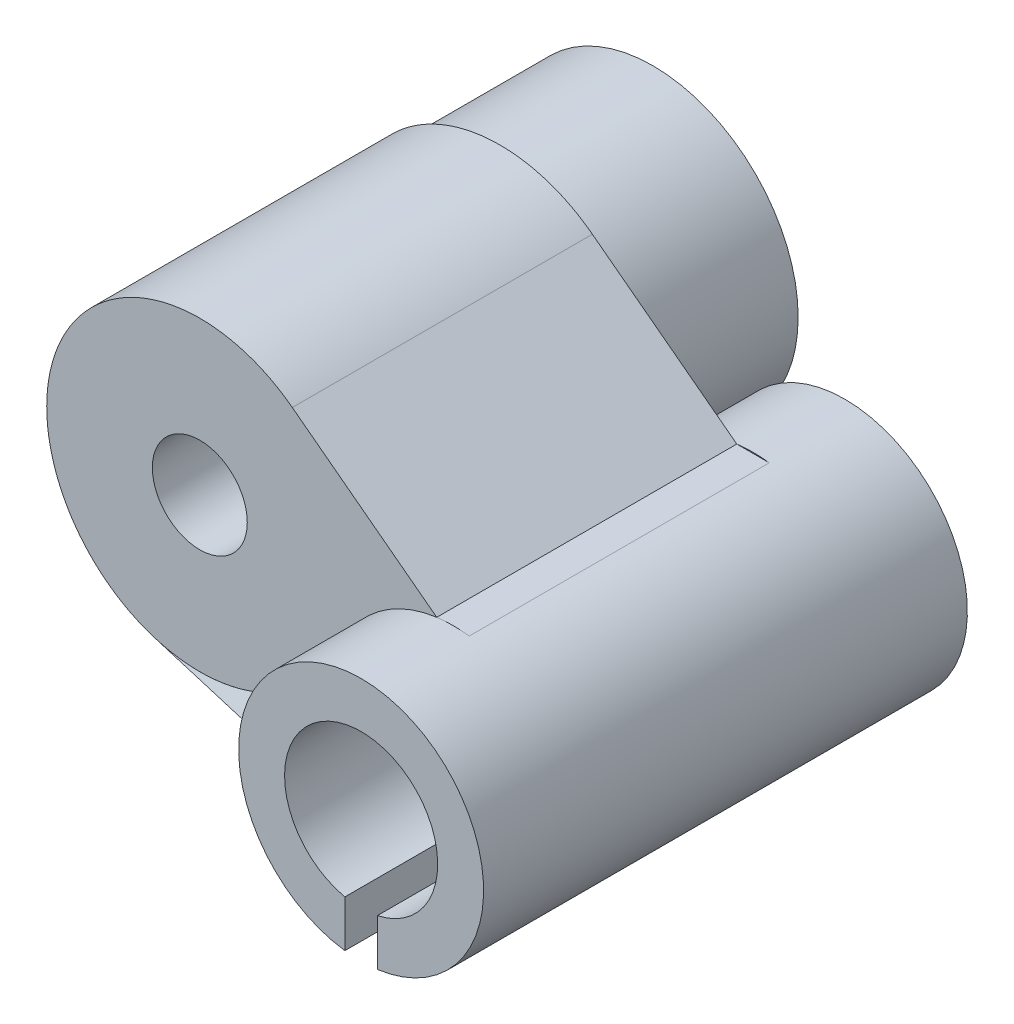
ISO-10303-21;
HEADER;
FILE_DESCRIPTION(('STEP AP214'),'2;1');
FILE_NAME('part.step','',(''),(''),'','','');
FILE_SCHEMA(('AUTOMOTIVE_DESIGN { 1 0 10303 214 1 1 1 1 }'));
ENDSEC;
DATA;
#1=APPLICATION_CONTEXT('core data for automotive mechanical design processes');
#2=APPLICATION_PROTOCOL_DEFINITION('international standard','automotive_design',2000,#1);
#3=PRODUCT_CONTEXT('',#1,'mechanical');
#4=PRODUCT('Part','Part','',(#3));
#5=PRODUCT_RELATED_PRODUCT_CATEGORY('part','',(#4));
#6=PRODUCT_DEFINITION_FORMATION('','',#4);
#7=PRODUCT_DEFINITION_CONTEXT('part definition',#1,'design');
#8=PRODUCT_DEFINITION('design','',#6,#7);
#9=PRODUCT_DEFINITION_SHAPE('','',#8);
#10=(LENGTH_UNIT() NAMED_UNIT(*) SI_UNIT(.MILLI.,.METRE.));
#11=(NAMED_UNIT(*) PLANE_ANGLE_UNIT() SI_UNIT($,.RADIAN.));
#12=(NAMED_UNIT(*) SI_UNIT($,.STERADIAN.) SOLID_ANGLE_UNIT());
#13=UNCERTAINTY_MEASURE_WITH_UNIT(LENGTH_MEASURE(1.E-05),#10,'distance_accuracy_value','');
#14=(GEOMETRIC_REPRESENTATION_CONTEXT(3) GLOBAL_UNCERTAINTY_ASSIGNED_CONTEXT((#13)) GLOBAL_UNIT_ASSIGNED_CONTEXT((#10,
#11,#12)) REPRESENTATION_CONTEXT('',''));
#15=CARTESIAN_POINT('',(0.,0.,0.));
#16=DIRECTION('',(0.,0.,1.));
#17=DIRECTION('',(1.,0.,0.));
#18=AXIS2_PLACEMENT_3D('',#15,#16,#17);
#19=CARTESIAN_POINT('',(0.,0.,0.));
#20=DIRECTION('',(0.,0.,1.));
#21=DIRECTION('',(1.,0.,0.));
#22=AXIS2_PLACEMENT_3D('',#19,#20,#21);
#23=PLANE('',#22);
#24=DIRECTION('',(0.796911314060259,-0.604096314773357,0.));
#25=VECTOR('',#24,1.);
#26=CARTESIAN_POINT('',(3.02048157386672,3.98455657030121,0.));
#27=LINE('',#26,#25);
#28=CARTESIAN_POINT('',(3.02048157386678,3.9845565703013,0.));
#29=VERTEX_POINT('',#28);
#30=CARTESIAN_POINT('',(7.73730203035666,0.408984477221739,0.));
#31=VERTEX_POINT('',#30);
#32=EDGE_CURVE('E50',#29,#31,#27,.T.);
#33=ORIENTED_EDGE('',*,*,#32,.T.);
#34=CARTESIAN_POINT('',(8.26783953936249,-3.55567565343347,0.));
#35=DIRECTION('',(0.,0.,1.));
#36=DIRECTION('',(1.,0.,0.));
#37=AXIS2_PLACEMENT_3D('',#34,#35,#36);
#38=CIRCLE('',#37,3.99999999998983);
#39=CARTESIAN_POINT('',(7.10561285640501,-7.38310679420404,0.));
#40=VERTEX_POINT('',#39);
#41=EDGE_CURVE('E43',#31,#40,#38,.T.);
#42=ORIENTED_EDGE('',*,*,#41,.T.);
#43=DIRECTION('',(-0.956857785199537,0.290556670725414,0.));
#44=VECTOR('',#43,1.);
#45=CARTESIAN_POINT('',(-1.4527833536177,-4.78428892596683,0.));
#46=LINE('',#45,#44);
#47=CARTESIAN_POINT('',(-1.35380663932124,-4.81434390908987,0.));
#48=VERTEX_POINT('',#47);
#49=EDGE_CURVE('E113',#40,#48,#46,.T.);
#50=ORIENTED_EDGE('',*,*,#49,.T.);
#51=CARTESIAN_POINT('',(-0.00105129220528597,-8.54083825260754E-05,0.));
#52=DIRECTION('',(0.,0.,-1.));
#53=DIRECTION('',(-1.,0.,0.));
#54=AXIS2_PLACEMENT_3D('',#51,#52,#53);
#55=CIRCLE('',#54,5.00070314463714);
#56=CARTESIAN_POINT('',(3.62377714828595,-3.44503108542732,0.));
#57=VERTEX_POINT('',#56);
#58=EDGE_CURVE('E138',#57,#48,#55,.T.);
#59=ORIENTED_EDGE('',*,*,#58,.F.);
#60=CARTESIAN_POINT('',(0.,0.,0.));
#61=DIRECTION('',(0.,0.,1.));
#62=DIRECTION('',(1.,0.,0.));
#63=AXIS2_PLACEMENT_3D('',#60,#61,#62);
#64=CIRCLE('',#63,5.);
#65=EDGE_CURVE('E126',#29,#57,#64,.T.);
#66=ORIENTED_EDGE('',*,*,#65,.F.);
#67=EDGE_LOOP('',(#33,#42,#50,#59,#66));
#68=FACE_BOUND('',#67,.T.);
#69=CARTESIAN_POINT('',(0.,0.,0.));
#70=DIRECTION('',(0.,0.,1.));
#71=DIRECTION('',(1.,0.,0.));
#72=AXIS2_PLACEMENT_3D('',#69,#70,#71);
#73=CIRCLE('',#72,4.74135826941333);
#74=CARTESIAN_POINT('',(4.74135826941333,0.,0.));
#75=VERTEX_POINT('',#74);
#76=EDGE_CURVE('E11',#75,#75,#73,.F.);
#77=ORIENTED_EDGE('',*,*,#76,.F.);
#78=EDGE_LOOP('',(#77));
#79=FACE_BOUND('',#78,.T.);
#80=ADVANCED_FACE('F35',(#68,#79),#23,.F.);
#81=CARTESIAN_POINT('',(0.,0.,9.8));
#82=DIRECTION('',(0.,0.,-1.));
#83=DIRECTION('',(-1.,0.,0.));
#84=AXIS2_PLACEMENT_3D('',#81,#82,#83);
#85=CYLINDRICAL_SURFACE('',#84,5.);
#86=DIRECTION('',(0.,0.,-1.));
#87=VECTOR('',#86,1.);
#88=CARTESIAN_POINT('',(3.62377714828595,-3.44503108542732,27.6300811187603));
#89=LINE('',#88,#87);
#90=CARTESIAN_POINT('',(3.62377714828595,-3.44503108542732,9.8));
#91=VERTEX_POINT('',#90);
#92=EDGE_CURVE('E132',#91,#57,#89,.T.);
#93=ORIENTED_EDGE('',*,*,#92,.F.);
#94=CARTESIAN_POINT('',(0.,0.,9.8));
#95=DIRECTION('',(0.,0.,1.));
#96=DIRECTION('',(1.,0.,0.));
#97=AXIS2_PLACEMENT_3D('',#94,#95,#96);
#98=CIRCLE('',#97,5.);
#99=CARTESIAN_POINT('',(3.02048157386679,3.9845565703013,9.8));
#100=VERTEX_POINT('',#99);
#101=EDGE_CURVE('E101',#100,#91,#98,.T.);
#102=ORIENTED_EDGE('',*,*,#101,.F.);
#103=DIRECTION('',(0.,0.,-1.));
#104=VECTOR('',#103,1.);
#105=CARTESIAN_POINT('',(3.02048157386672,3.98455657030121,27.6300811187603));
#106=LINE('',#105,#104);
#107=EDGE_CURVE('E133',#100,#29,#106,.T.);
#108=ORIENTED_EDGE('',*,*,#107,.T.);
#109=ORIENTED_EDGE('',*,*,#65,.T.);
#110=EDGE_LOOP('',(#93,#102,#108,#109));
#111=FACE_BOUND('',#110,.T.);
#112=ADVANCED_FACE('F37',(#111),#85,.T.);
#113=CARTESIAN_POINT('',(0.,0.,9.8));
#114=DIRECTION('',(0.,0.,1.));
#115=DIRECTION('',(1.,0.,0.));
#116=AXIS2_PLACEMENT_3D('',#113,#114,#115);
#117=PLANE('',#116);
#118=CARTESIAN_POINT('',(8.26783953936249,-3.55567565343347,9.8));
#119=DIRECTION('',(0.,0.,1.));
#120=DIRECTION('',(1.,0.,0.));
#121=AXIS2_PLACEMENT_3D('',#118,#119,#120);
#122=CIRCLE('',#121,3.99999999998983);
#123=CARTESIAN_POINT('',(7.73730203049847,0.408984477221739,9.8));
#124=VERTEX_POINT('',#123);
#125=CARTESIAN_POINT('',(7.10561285640653,-7.38310679419903,9.8));
#126=VERTEX_POINT('',#125);
#127=EDGE_CURVE('E90',#124,#126,#122,.T.);
#128=ORIENTED_EDGE('',*,*,#127,.F.);
#129=DIRECTION('',(0.796911314060259,-0.604096314773357,0.));
#130=VECTOR('',#129,1.);
#131=CARTESIAN_POINT('',(3.02048157386672,3.98455657030121,9.8));
#132=LINE('',#131,#130);
#133=EDGE_CURVE('E141',#100,#124,#132,.T.);
#134=ORIENTED_EDGE('',*,*,#133,.F.);
#135=ORIENTED_EDGE('',*,*,#101,.T.);
#136=CARTESIAN_POINT('',(-0.00105129220528597,-8.54083825260754E-05,9.8));
#137=DIRECTION('',(0.,0.,1.));
#138=DIRECTION('',(1.,0.,0.));
#139=AXIS2_PLACEMENT_3D('',#136,#137,#138);
#140=CIRCLE('',#139,5.00070314463714);
#141=CARTESIAN_POINT('',(-1.35380663932124,-4.81434390908987,9.8));
#142=VERTEX_POINT('',#141);
#143=EDGE_CURVE('E83',#91,#142,#140,.F.);
#144=ORIENTED_EDGE('',*,*,#143,.T.);
#145=DIRECTION('',(-0.956857785199537,0.290556670725414,0.));
#146=VECTOR('',#145,1.);
#147=CARTESIAN_POINT('',(-1.4527833536177,-4.78428892596683,9.8));
#148=LINE('',#147,#146);
#149=EDGE_CURVE('E104',#126,#142,#148,.T.);
#150=ORIENTED_EDGE('',*,*,#149,.F.);
#151=EDGE_LOOP('',(#128,#134,#135,#144,#150));
#152=FACE_BOUND('',#151,.T.);
#153=CARTESIAN_POINT('',(0.,0.,9.8));
#154=DIRECTION('',(0.,0.,1.));
#155=DIRECTION('',(1.,0.,0.));
#156=AXIS2_PLACEMENT_3D('',#153,#154,#155);
#157=CIRCLE('',#156,1.55);
#158=CARTESIAN_POINT('',(1.55,0.,9.8));
#159=VERTEX_POINT('',#158);
#160=EDGE_CURVE('E122',#159,#159,#157,.T.);
#161=ORIENTED_EDGE('',*,*,#160,.F.);
#162=EDGE_LOOP('',(#161));
#163=FACE_BOUND('',#162,.T.);
#164=ADVANCED_FACE('F105',(#152,#163),#117,.T.);
#165=CARTESIAN_POINT('',(0.,0.,9.8));
#166=DIRECTION('',(0.,0.,-1.));
#167=DIRECTION('',(-1.,0.,0.));
#168=AXIS2_PLACEMENT_3D('',#165,#166,#167);
#169=CYLINDRICAL_SURFACE('',#168,1.55);
#170=ORIENTED_EDGE('',*,*,#160,.T.);
#171=EDGE_LOOP('',(#170));
#172=FACE_BOUND('',#171,.T.);
#173=CARTESIAN_POINT('',(0.,0.,-5.));
#174=DIRECTION('',(0.,0.,-1.));
#175=DIRECTION('',(-1.,0.,0.));
#176=AXIS2_PLACEMENT_3D('',#173,#174,#175);
#177=CIRCLE('',#176,1.55);
#178=CARTESIAN_POINT('',(-1.55,0.,-5.));
#179=VERTEX_POINT('',#178);
#180=EDGE_CURVE('E197',#179,#179,#177,.T.);
#181=ORIENTED_EDGE('',*,*,#180,.T.);
#182=EDGE_LOOP('',(#181));
#183=FACE_BOUND('',#182,.T.);
#184=ADVANCED_FACE('F225',(#172,#183),#169,.F.);
#185=CARTESIAN_POINT('',(8.26783953929881,-3.55567565343173,27.6300811187603));
#186=DIRECTION('',(0.,0.,-1.));
#187=DIRECTION('',(-1.,0.,0.));
#188=AXIS2_PLACEMENT_3D('',#185,#186,#187);
#189=CYLINDRICAL_SURFACE('',#188,3.99999999998311);
#190=DIRECTION('',(0.,0.,-1.));
#191=VECTOR('',#190,1.);
#192=CARTESIAN_POINT('',(8.79837704823966,-7.52033578408693,27.6300811187603));
#193=LINE('',#192,#191);
#194=CARTESIAN_POINT('',(8.79837704823966,-7.52033578408693,12.8));
#195=VERTEX_POINT('',#194);
#196=CARTESIAN_POINT('',(8.79837704823966,-7.52033578408693,-3.));
#197=VERTEX_POINT('',#196);
#198=EDGE_CURVE('E159',#195,#197,#193,.T.);
#199=ORIENTED_EDGE('',*,*,#198,.T.);
#200=CARTESIAN_POINT('',(8.26783953936249,-3.55567565343347,-3.));
#201=DIRECTION('',(0.,0.,1.));
#202=DIRECTION('',(1.,0.,0.));
#203=AXIS2_PLACEMENT_3D('',#200,#201,#202);
#204=CIRCLE('',#203,3.99999999998983);
#205=CARTESIAN_POINT('',(7.7373020303587,-7.52033578406998,-3.));
#206=VERTEX_POINT('',#205);
#207=EDGE_CURVE('E187',#197,#206,#204,.T.);
#208=ORIENTED_EDGE('',*,*,#207,.T.);
#209=DIRECTION('',(0.,0.,-1.));
#210=VECTOR('',#209,1.);
#211=CARTESIAN_POINT('',(7.73730203035666,-7.52033578408521,27.6300811187603));
#212=LINE('',#211,#210);
#213=CARTESIAN_POINT('',(7.7373020303587,-7.52033578406998,12.8));
#214=VERTEX_POINT('',#213);
#215=EDGE_CURVE('E119',#214,#206,#212,.T.);
#216=ORIENTED_EDGE('',*,*,#215,.F.);
#217=CARTESIAN_POINT('',(8.26783953936249,-3.55567565343347,12.8));
#218=DIRECTION('',(0.,0.,1.));
#219=DIRECTION('',(1.,0.,0.));
#220=AXIS2_PLACEMENT_3D('',#217,#218,#219);
#221=CIRCLE('',#220,3.99999999998983);
#222=EDGE_CURVE('E173',#195,#214,#221,.T.);
#223=ORIENTED_EDGE('',*,*,#222,.F.);
#224=EDGE_LOOP('',(#199,#208,#216,#223));
#225=FACE_BOUND('',#224,.T.);
#226=CARTESIAN_POINT('',(8.79837704823966,0.408984477223457,0.));
#227=VERTEX_POINT('',#226);
#228=EDGE_CURVE('E181',#227,#31,#38,.T.);
#229=ORIENTED_EDGE('',*,*,#228,.F.);
#230=DIRECTION('',(0.,0.,-1.));
#231=VECTOR('',#230,1.);
#232=CARTESIAN_POINT('',(8.79837704823966,0.408984477223457,27.6300811187603));
#233=LINE('',#232,#231);
#234=CARTESIAN_POINT('',(8.7983770482392,0.40898447722004,9.8));
#235=VERTEX_POINT('',#234);
#236=EDGE_CURVE('E59',#235,#227,#233,.T.);
#237=ORIENTED_EDGE('',*,*,#236,.F.);
#238=EDGE_CURVE('E99',#235,#124,#122,.T.);
#239=ORIENTED_EDGE('',*,*,#238,.T.);
#240=ORIENTED_EDGE('',*,*,#127,.T.);
#241=DIRECTION('',(0.,0.,-1.));
#242=VECTOR('',#241,1.);
#243=CARTESIAN_POINT('',(7.10561285640653,-7.38310679419903,27.6300811187603));
#244=LINE('',#243,#242);
#245=EDGE_CURVE('E96',#126,#40,#244,.T.);
#246=ORIENTED_EDGE('',*,*,#245,.T.);
#247=ORIENTED_EDGE('',*,*,#41,.F.);
#248=EDGE_LOOP('',(#229,#237,#239,#240,#246,#247));
#249=FACE_BOUND('',#248,.T.);
#250=ADVANCED_FACE('F92',(#225,#249),#189,.T.);
#251=CARTESIAN_POINT('',(-1.4527833536177,-4.78428892596683,27.6300811187603));
#252=DIRECTION('',(-0.290556670725414,-0.956857785199537,0.));
#253=DIRECTION('',(0.956857785199537,-0.290556670725414,0.));
#254=AXIS2_PLACEMENT_3D('',#251,#252,#253);
#255=PLANE('',#254);
#256=ORIENTED_EDGE('',*,*,#245,.F.);
#257=ORIENTED_EDGE('',*,*,#149,.T.);
#258=DIRECTION('',(0.,0.,-1.));
#259=VECTOR('',#258,1.);
#260=CARTESIAN_POINT('',(-1.35380663932124,-4.81434390908987,27.6300811187603));
#261=LINE('',#260,#259);
#262=EDGE_CURVE('E108',#142,#48,#261,.T.);
#263=ORIENTED_EDGE('',*,*,#262,.T.);
#264=ORIENTED_EDGE('',*,*,#49,.F.);
#265=EDGE_LOOP('',(#256,#257,#263,#264));
#266=FACE_BOUND('',#265,.T.);
#267=ADVANCED_FACE('F111',(#266),#255,.T.);
#268=CARTESIAN_POINT('',(-0.00105129220528597,-8.54083825260754E-05,27.6300811187603));
#269=DIRECTION('',(0.,0.,-1.));
#270=DIRECTION('',(-1.,0.,0.));
#271=AXIS2_PLACEMENT_3D('',#268,#269,#270);
#272=CYLINDRICAL_SURFACE('',#271,5.00070314463714);
#273=ORIENTED_EDGE('',*,*,#143,.F.);
#274=ORIENTED_EDGE('',*,*,#92,.T.);
#275=ORIENTED_EDGE('',*,*,#58,.T.);
#276=ORIENTED_EDGE('',*,*,#262,.F.);
#277=EDGE_LOOP('',(#273,#274,#275,#276));
#278=FACE_BOUND('',#277,.T.);
#279=ADVANCED_FACE('F262',(#278),#272,.F.);
#280=CARTESIAN_POINT('',(3.02048157386672,3.98455657030121,27.6300811187603));
#281=DIRECTION('',(0.604096314773357,0.796911314060259,0.));
#282=DIRECTION('',(-0.796911314060259,0.604096314773357,0.));
#283=AXIS2_PLACEMENT_3D('',#280,#281,#282);
#284=PLANE('',#283);
#285=ORIENTED_EDGE('',*,*,#107,.F.);
#286=ORIENTED_EDGE('',*,*,#133,.T.);
#287=DIRECTION('',(0.,0.,-1.));
#288=VECTOR('',#287,1.);
#289=CARTESIAN_POINT('',(7.73730203035666,0.408984477221739,27.6300811187603));
#290=LINE('',#289,#288);
#291=EDGE_CURVE('E152',#124,#31,#290,.T.);
#292=ORIENTED_EDGE('',*,*,#291,.T.);
#293=ORIENTED_EDGE('',*,*,#32,.F.);
#294=EDGE_LOOP('',(#285,#286,#292,#293));
#295=FACE_BOUND('',#294,.T.);
#296=ADVANCED_FACE('F164',(#295),#284,.T.);
#297=CARTESIAN_POINT('',(-6.62160472420523E-13,0.408984477209212,27.6300811187603));
#298=DIRECTION('',(1.61903570751367E-12,-1.,0.));
#299=DIRECTION('',(1.,1.61903570751367E-12,0.));
#300=AXIS2_PLACEMENT_3D('',#297,#298,#299);
#301=PLANE('',#300);
#302=DIRECTION('',(-1.,-1.61903570751367E-12,0.));
#303=VECTOR('',#302,1.);
#304=CARTESIAN_POINT('',(-6.62160472420523E-13,0.408984477209212,9.8));
#305=LINE('',#304,#303);
#306=EDGE_CURVE('E146',#235,#124,#305,.T.);
#307=ORIENTED_EDGE('',*,*,#306,.F.);
#308=ORIENTED_EDGE('',*,*,#236,.T.);
#309=DIRECTION('',(-1.,-1.61903570751367E-12,0.));
#310=VECTOR('',#309,1.);
#311=CARTESIAN_POINT('',(-6.62160472420523E-13,0.408984477209212,0.));
#312=LINE('',#311,#310);
#313=EDGE_CURVE('E162',#227,#31,#312,.T.);
#314=ORIENTED_EDGE('',*,*,#313,.T.);
#315=ORIENTED_EDGE('',*,*,#291,.F.);
#316=EDGE_LOOP('',(#307,#308,#314,#315));
#317=FACE_BOUND('',#316,.T.);
#318=ADVANCED_FACE('F165',(#317),#301,.F.);
#319=CARTESIAN_POINT('',(8.79837704823966,0.,27.6300811187603));
#320=DIRECTION('',(-1.,0.,0.));
#321=DIRECTION('',(0.,0.,1.));
#322=AXIS2_PLACEMENT_3D('',#319,#320,#321);
#323=PLANE('',#322);
#324=ORIENTED_EDGE('',*,*,#198,.F.);
#325=DIRECTION('',(0.,-1.,0.));
#326=VECTOR('',#325,1.);
#327=CARTESIAN_POINT('',(8.79837704823966,-5.99873315410724,12.8));
#328=LINE('',#327,#326);
#329=CARTESIAN_POINT('',(8.79837704823966,-5.99873315410724,12.8));
#330=VERTEX_POINT('',#329);
#331=EDGE_CURVE('E176',#330,#195,#328,.T.);
#332=ORIENTED_EDGE('',*,*,#331,.F.);
#333=DIRECTION('',(0.,0.,-1.));
#334=VECTOR('',#333,1.);
#335=CARTESIAN_POINT('',(8.79837704823966,-5.99873315410724,27.6300811187603));
#336=LINE('',#335,#334);
#337=CARTESIAN_POINT('',(8.79837704823966,-5.99873315410724,-3.));
#338=VERTEX_POINT('',#337);
#339=EDGE_CURVE('E156',#330,#338,#336,.T.);
#340=ORIENTED_EDGE('',*,*,#339,.T.);
#341=DIRECTION('',(0.,-1.,0.));
#342=VECTOR('',#341,1.);
#343=CARTESIAN_POINT('',(8.79837704823966,-5.99873315410724,-3.));
#344=LINE('',#343,#342);
#345=EDGE_CURVE('E170',#338,#197,#344,.T.);
#346=ORIENTED_EDGE('',*,*,#345,.T.);
#347=EDGE_LOOP('',(#324,#332,#340,#346));
#348=FACE_BOUND('',#347,.T.);
#349=ADVANCED_FACE('F280',(#348),#323,.T.);
#350=CARTESIAN_POINT('',(8.26783953929881,-3.55567565343173,27.6300811187603));
#351=DIRECTION('',(0.,0.,-1.));
#352=DIRECTION('',(-1.,0.,0.));
#353=AXIS2_PLACEMENT_3D('',#350,#351,#352);
#354=CYLINDRICAL_SURFACE('',#353,2.5);
#355=ORIENTED_EDGE('',*,*,#339,.F.);
#356=CARTESIAN_POINT('',(8.26783953929882,-3.55567565343173,12.8));
#357=DIRECTION('',(0.,0.,-1.));
#358=DIRECTION('',(-1.,0.,0.));
#359=AXIS2_PLACEMENT_3D('',#356,#357,#358);
#360=CIRCLE('',#359,2.5);
#361=CARTESIAN_POINT('',(7.73730203035796,-5.99873315410724,12.8));
#362=VERTEX_POINT('',#361);
#363=EDGE_CURVE('E169',#362,#330,#360,.T.);
#364=ORIENTED_EDGE('',*,*,#363,.F.);
#365=DIRECTION('',(0.,0.,-1.));
#366=VECTOR('',#365,1.);
#367=CARTESIAN_POINT('',(7.73730203035796,-5.99873315410724,27.6300811187603));
#368=LINE('',#367,#366);
#369=CARTESIAN_POINT('',(7.73730203035796,-5.99873315410724,-3.));
#370=VERTEX_POINT('',#369);
#371=EDGE_CURVE('E123',#362,#370,#368,.T.);
#372=ORIENTED_EDGE('',*,*,#371,.T.);
#373=CARTESIAN_POINT('',(8.26783953929882,-3.55567565343173,-3.));
#374=DIRECTION('',(0.,0.,-1.));
#375=DIRECTION('',(-1.,0.,0.));
#376=AXIS2_PLACEMENT_3D('',#373,#374,#375);
#377=CIRCLE('',#376,2.5);
#378=EDGE_CURVE('E183',#370,#338,#377,.T.);
#379=ORIENTED_EDGE('',*,*,#378,.T.);
#380=EDGE_LOOP('',(#355,#364,#372,#379));
#381=FACE_BOUND('',#380,.T.);
#382=ADVANCED_FACE('F287',(#381),#354,.F.);
#383=CARTESIAN_POINT('',(7.7373020303631,-6.62458219082741E-12,27.6300811187603));
#384=DIRECTION('',(-1.,8.56187617444802E-13,0.));
#385=DIRECTION('',(-8.56187617444802E-13,-1.,0.));
#386=AXIS2_PLACEMENT_3D('',#383,#384,#385);
#387=PLANE('',#386);
#388=ORIENTED_EDGE('',*,*,#371,.F.);
#389=DIRECTION('',(-4.82816852185754E-13,1.,0.));
#390=VECTOR('',#389,1.);
#391=CARTESIAN_POINT('',(7.73730203035796,-5.99873315410724,12.8));
#392=LINE('',#391,#390);
#393=EDGE_CURVE('E149',#214,#362,#392,.T.);
#394=ORIENTED_EDGE('',*,*,#393,.F.);
#395=ORIENTED_EDGE('',*,*,#215,.T.);
#396=DIRECTION('',(-4.82816852185754E-13,1.,0.));
#397=VECTOR('',#396,1.);
#398=CARTESIAN_POINT('',(7.73730203035796,-5.99873315410724,-3.));
#399=LINE('',#398,#397);
#400=EDGE_CURVE('E190',#206,#370,#399,.T.);
#401=ORIENTED_EDGE('',*,*,#400,.T.);
#402=EDGE_LOOP('',(#388,#394,#395,#401));
#403=FACE_BOUND('',#402,.T.);
#404=ADVANCED_FACE('F295',(#403),#387,.F.);
#405=CARTESIAN_POINT('',(8.26783953929882,-3.55567565343173,12.8));
#406=DIRECTION('',(0.,0.,-1.));
#407=DIRECTION('',(-1.,0.,0.));
#408=AXIS2_PLACEMENT_3D('',#405,#406,#407);
#409=PLANE('',#408);
#410=ORIENTED_EDGE('',*,*,#363,.T.);
#411=ORIENTED_EDGE('',*,*,#331,.T.);
#412=ORIENTED_EDGE('',*,*,#222,.T.);
#413=ORIENTED_EDGE('',*,*,#393,.T.);
#414=EDGE_LOOP('',(#410,#411,#412,#413));
#415=FACE_BOUND('',#414,.T.);
#416=ADVANCED_FACE('F303',(#415),#409,.F.);
#417=CARTESIAN_POINT('',(8.26783953929882,-3.55567565343173,9.8));
#418=DIRECTION('',(0.,0.,-1.));
#419=DIRECTION('',(-1.,0.,0.));
#420=AXIS2_PLACEMENT_3D('',#417,#418,#419);
#421=PLANE('',#420);
#422=ORIENTED_EDGE('',*,*,#238,.F.);
#423=ORIENTED_EDGE('',*,*,#306,.T.);
#424=EDGE_LOOP('',(#422,#423));
#425=FACE_BOUND('',#424,.T.);
#426=ADVANCED_FACE('F311',(#425),#421,.T.);
#427=CARTESIAN_POINT('',(8.26783953929882,-3.55567565343173,0.));
#428=DIRECTION('',(0.,0.,1.));
#429=DIRECTION('',(-1.,0.,0.));
#430=AXIS2_PLACEMENT_3D('',#427,#428,#429);
#431=PLANE('',#430);
#432=ORIENTED_EDGE('',*,*,#313,.F.);
#433=ORIENTED_EDGE('',*,*,#228,.T.);
#434=EDGE_LOOP('',(#432,#433));
#435=FACE_BOUND('',#434,.T.);
#436=ADVANCED_FACE('F318',(#435),#431,.T.);
#437=CARTESIAN_POINT('',(8.26783953929882,-3.55567565343173,-3.));
#438=DIRECTION('',(0.,0.,1.));
#439=DIRECTION('',(-1.,0.,0.));
#440=AXIS2_PLACEMENT_3D('',#437,#438,#439);
#441=PLANE('',#440);
#442=ORIENTED_EDGE('',*,*,#378,.F.);
#443=ORIENTED_EDGE('',*,*,#400,.F.);
#444=ORIENTED_EDGE('',*,*,#207,.F.);
#445=ORIENTED_EDGE('',*,*,#345,.F.);
#446=EDGE_LOOP('',(#442,#443,#444,#445));
#447=FACE_BOUND('',#446,.T.);
#448=ADVANCED_FACE('F219',(#447),#441,.F.);
#449=CARTESIAN_POINT('',(0.,0.,-5.));
#450=DIRECTION('',(0.,0.,-1.));
#451=DIRECTION('',(-1.,0.,0.));
#452=AXIS2_PLACEMENT_3D('',#449,#450,#451);
#453=PLANE('',#452);
#454=CARTESIAN_POINT('',(-0.408594663770856,-2.65202543158871,-5.));
#455=DIRECTION('',(0.,0.,-1.));
#456=DIRECTION('',(-1.,0.,0.));
#457=AXIS2_PLACEMENT_3D('',#454,#455,#456);
#458=CIRCLE('',#457,0.5);
#459=CARTESIAN_POINT('',(-0.908594663770856,-2.65202543158871,-5.));
#460=VERTEX_POINT('',#459);
#461=EDGE_CURVE('E201',#460,#460,#458,.T.);
#462=ORIENTED_EDGE('',*,*,#461,.F.);
#463=EDGE_LOOP('',(#462));
#464=FACE_BOUND('',#463,.T.);
#465=CARTESIAN_POINT('',(0.,0.,-5.));
#466=DIRECTION('',(0.,0.,-1.));
#467=DIRECTION('',(-1.,0.,0.));
#468=AXIS2_PLACEMENT_3D('',#465,#466,#467);
#469=CIRCLE('',#468,4.74135826941333);
#470=CARTESIAN_POINT('',(-4.74135826941333,0.,-5.));
#471=VERTEX_POINT('',#470);
#472=EDGE_CURVE('E184',#471,#471,#469,.T.);
#473=ORIENTED_EDGE('',*,*,#472,.T.);
#474=EDGE_LOOP('',(#473));
#475=FACE_BOUND('',#474,.T.);
#476=ORIENTED_EDGE('',*,*,#180,.F.);
#477=EDGE_LOOP('',(#476));
#478=FACE_BOUND('',#477,.T.);
#479=ADVANCED_FACE('F216',(#464,#475,#478),#453,.T.);
#480=CARTESIAN_POINT('',(0.,0.,-5.));
#481=DIRECTION('',(0.,0.,1.));
#482=DIRECTION('',(1.,0.,0.));
#483=AXIS2_PLACEMENT_3D('',#480,#481,#482);
#484=CYLINDRICAL_SURFACE('',#483,4.74135826941333);
#485=ORIENTED_EDGE('',*,*,#472,.F.);
#486=EDGE_LOOP('',(#485));
#487=FACE_BOUND('',#486,.T.);
#488=ORIENTED_EDGE('',*,*,#76,.T.);
#489=EDGE_LOOP('',(#488));
#490=FACE_BOUND('',#489,.T.);
#491=ADVANCED_FACE('F212',(#487,#490),#484,.T.);
#492=CARTESIAN_POINT('',(-0.408594663770856,-2.65202543158871,-7.));
#493=DIRECTION('',(0.,0.,1.));
#494=DIRECTION('',(1.,0.,0.));
#495=AXIS2_PLACEMENT_3D('',#492,#493,#494);
#496=CYLINDRICAL_SURFACE('',#495,0.5);
#497=CARTESIAN_POINT('',(-0.408594663770856,-2.65202543158871,-7.));
#498=DIRECTION('',(0.,0.,-1.));
#499=DIRECTION('',(-1.,0.,0.));
#500=AXIS2_PLACEMENT_3D('',#497,#498,#499);
#501=CIRCLE('',#500,0.5);
#502=CARTESIAN_POINT('',(-0.908594663770856,-2.65202543158871,-7.));
#503=VERTEX_POINT('',#502);
#504=EDGE_CURVE('E200',#503,#503,#501,.T.);
#505=ORIENTED_EDGE('',*,*,#504,.F.);
#506=EDGE_LOOP('',(#505));
#507=FACE_BOUND('',#506,.T.);
#508=ORIENTED_EDGE('',*,*,#461,.T.);
#509=EDGE_LOOP('',(#508));
#510=FACE_BOUND('',#509,.T.);
#511=ADVANCED_FACE('F209',(#507,#510),#496,.T.);
#512=CARTESIAN_POINT('',(-0.408594663770856,-2.65202543158871,-7.));
#513=DIRECTION('',(0.,0.,-1.));
#514=DIRECTION('',(-1.,0.,0.));
#515=AXIS2_PLACEMENT_3D('',#512,#513,#514);
#516=PLANE('',#515);
#517=ORIENTED_EDGE('',*,*,#504,.T.);
#518=EDGE_LOOP('',(#517));
#519=FACE_BOUND('',#518,.T.);
#520=ADVANCED_FACE('F207',(#519),#516,.T.);
#521=CLOSED_SHELL('',(#80,#112,#164,#184,#250,#267,#279,#296,#318,#349,#382,#404,#416,#426,#436,
#448,#479,#491,#511,#520));
#522=MANIFOLD_SOLID_BREP('B2',#521);
#523=ADVANCED_BREP_SHAPE_REPRESENTATION('',(#18,#522),#14);
#524=SHAPE_DEFINITION_REPRESENTATION(#9,#523);
ENDSEC;
END-ISO-10303-21;
